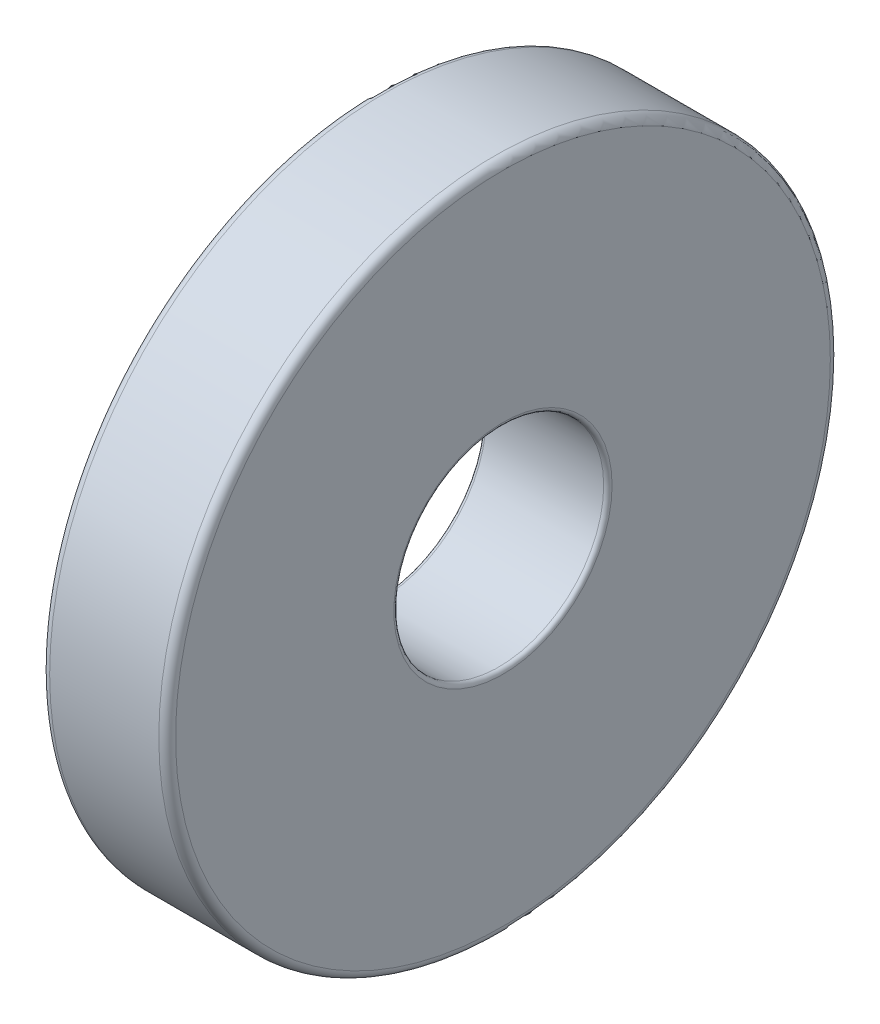
ISO-10303-21;
HEADER;
FILE_DESCRIPTION(('STEP AP214'),'2;1');
FILE_NAME('part.step','',(''),(''),'','','');
FILE_SCHEMA(('AUTOMOTIVE_DESIGN { 1 0 10303 214 1 1 1 1 }'));
ENDSEC;
DATA;
#1=APPLICATION_CONTEXT('core data for automotive mechanical design processes');
#2=APPLICATION_PROTOCOL_DEFINITION('international standard','automotive_design',2000,#1);
#3=PRODUCT_CONTEXT('',#1,'mechanical');
#4=PRODUCT('Part','Part','',(#3));
#5=PRODUCT_RELATED_PRODUCT_CATEGORY('part','',(#4));
#6=PRODUCT_DEFINITION_FORMATION('','',#4);
#7=PRODUCT_DEFINITION_CONTEXT('part definition',#1,'design');
#8=PRODUCT_DEFINITION('design','',#6,#7);
#9=PRODUCT_DEFINITION_SHAPE('','',#8);
#10=(LENGTH_UNIT() NAMED_UNIT(*) SI_UNIT(.MILLI.,.METRE.));
#11=(NAMED_UNIT(*) PLANE_ANGLE_UNIT() SI_UNIT($,.RADIAN.));
#12=(NAMED_UNIT(*) SI_UNIT($,.STERADIAN.) SOLID_ANGLE_UNIT());
#13=UNCERTAINTY_MEASURE_WITH_UNIT(LENGTH_MEASURE(1.E-05),#10,'distance_accuracy_value','');
#14=(GEOMETRIC_REPRESENTATION_CONTEXT(3) GLOBAL_UNCERTAINTY_ASSIGNED_CONTEXT((#13)) GLOBAL_UNIT_ASSIGNED_CONTEXT((#10,
#11,#12)) REPRESENTATION_CONTEXT('',''));
#15=CARTESIAN_POINT('',(0.,0.,0.));
#16=DIRECTION('',(0.,0.,1.));
#17=DIRECTION('',(1.,0.,0.));
#18=AXIS2_PLACEMENT_3D('',#15,#16,#17);
#19=CARTESIAN_POINT('',(30.,0.,0.));
#20=DIRECTION('',(1.,0.,0.));
#21=DIRECTION('',(0.,0.,-1.));
#22=AXIS2_PLACEMENT_3D('',#19,#20,#21);
#23=PLANE('',#22);
#24=CARTESIAN_POINT('',(30.,0.,0.));
#25=DIRECTION('',(1.,0.,0.));
#26=DIRECTION('',(0.,0.,-1.));
#27=AXIS2_PLACEMENT_3D('',#24,#25,#26);
#28=CIRCLE('',#27,26.);
#29=CARTESIAN_POINT('',(30.,0.,-26.));
#30=VERTEX_POINT('',#29);
#31=EDGE_CURVE('E51',#30,#30,#28,.F.);
#32=ORIENTED_EDGE('',*,*,#31,.T.);
#33=EDGE_LOOP('',(#32));
#34=FACE_BOUND('',#33,.T.);
#35=CARTESIAN_POINT('',(30.,0.,0.));
#36=DIRECTION('',(1.,0.,0.));
#37=DIRECTION('',(0.,0.,-1.));
#38=AXIS2_PLACEMENT_3D('',#35,#36,#37);
#39=CIRCLE('',#38,78.);
#40=CARTESIAN_POINT('',(30.,0.,-78.));
#41=VERTEX_POINT('',#40);
#42=EDGE_CURVE('E79',#41,#41,#39,.T.);
#43=ORIENTED_EDGE('',*,*,#42,.T.);
#44=EDGE_LOOP('',(#43));
#45=FACE_BOUND('',#44,.T.);
#46=ADVANCED_FACE('F43',(#34,#45),#23,.T.);
#47=CARTESIAN_POINT('',(0.,0.,0.));
#48=DIRECTION('',(1.,0.,0.));
#49=DIRECTION('',(0.,0.,-1.));
#50=AXIS2_PLACEMENT_3D('',#47,#48,#49);
#51=PLANE('',#50);
#52=CARTESIAN_POINT('',(0.,0.,0.));
#53=DIRECTION('',(1.,0.,0.));
#54=DIRECTION('',(0.,0.,-1.));
#55=AXIS2_PLACEMENT_3D('',#52,#53,#54);
#56=CIRCLE('',#55,26.);
#57=CARTESIAN_POINT('',(0.,0.,-26.));
#58=VERTEX_POINT('',#57);
#59=EDGE_CURVE('E10',#58,#58,#56,.T.);
#60=ORIENTED_EDGE('',*,*,#59,.T.);
#61=EDGE_LOOP('',(#60));
#62=FACE_BOUND('',#61,.T.);
#63=CARTESIAN_POINT('',(0.,0.,0.));
#64=DIRECTION('',(1.,0.,0.));
#65=DIRECTION('',(0.,0.,-1.));
#66=AXIS2_PLACEMENT_3D('',#63,#64,#65);
#67=CIRCLE('',#66,78.);
#68=CARTESIAN_POINT('',(0.,0.,-78.));
#69=VERTEX_POINT('',#68);
#70=EDGE_CURVE('E67',#69,#69,#67,.F.);
#71=ORIENTED_EDGE('',*,*,#70,.T.);
#72=EDGE_LOOP('',(#71));
#73=FACE_BOUND('',#72,.T.);
#74=ADVANCED_FACE('F105',(#62,#73),#51,.F.);
#75=CARTESIAN_POINT('',(30.,0.,0.));
#76=DIRECTION('',(-1.,0.,0.));
#77=DIRECTION('',(0.,0.,1.));
#78=AXIS2_PLACEMENT_3D('',#75,#76,#77);
#79=CYLINDRICAL_SURFACE('',#78,80.);
#80=CARTESIAN_POINT('',(28.,0.,0.));
#81=DIRECTION('',(1.,0.,0.));
#82=DIRECTION('',(0.,0.,-1.));
#83=AXIS2_PLACEMENT_3D('',#80,#81,#82);
#84=CIRCLE('',#83,80.);
#85=CARTESIAN_POINT('',(28.,0.,-80.));
#86=VERTEX_POINT('',#85);
#87=EDGE_CURVE('E71',#86,#86,#84,.F.);
#88=ORIENTED_EDGE('',*,*,#87,.T.);
#89=EDGE_LOOP('',(#88));
#90=FACE_BOUND('',#89,.T.);
#91=CARTESIAN_POINT('',(2.,0.,0.));
#92=DIRECTION('',(1.,0.,0.));
#93=DIRECTION('',(0.,0.,-1.));
#94=AXIS2_PLACEMENT_3D('',#91,#92,#93);
#95=CIRCLE('',#94,80.);
#96=CARTESIAN_POINT('',(2.,0.,-80.));
#97=VERTEX_POINT('',#96);
#98=EDGE_CURVE('E75',#97,#97,#95,.T.);
#99=ORIENTED_EDGE('',*,*,#98,.T.);
#100=EDGE_LOOP('',(#99));
#101=FACE_BOUND('',#100,.T.);
#102=ADVANCED_FACE('F99',(#90,#101),#79,.T.);
#103=CARTESIAN_POINT('',(30.,0.,0.));
#104=DIRECTION('',(-1.,0.,0.));
#105=DIRECTION('',(0.,0.,1.));
#106=AXIS2_PLACEMENT_3D('',#103,#104,#105);
#107=CYLINDRICAL_SURFACE('',#106,25.);
#108=CARTESIAN_POINT('',(29.,0.,0.));
#109=DIRECTION('',(1.,0.,0.));
#110=DIRECTION('',(0.,0.,-1.));
#111=AXIS2_PLACEMENT_3D('',#108,#109,#110);
#112=CIRCLE('',#111,25.);
#113=CARTESIAN_POINT('',(29.,0.,-25.));
#114=VERTEX_POINT('',#113);
#115=EDGE_CURVE('E56',#114,#114,#112,.T.);
#116=ORIENTED_EDGE('',*,*,#115,.T.);
#117=EDGE_LOOP('',(#116));
#118=FACE_BOUND('',#117,.T.);
#119=CARTESIAN_POINT('',(1.,0.,0.));
#120=DIRECTION('',(1.,0.,0.));
#121=DIRECTION('',(0.,0.,-1.));
#122=AXIS2_PLACEMENT_3D('',#119,#120,#121);
#123=CIRCLE('',#122,25.);
#124=CARTESIAN_POINT('',(1.,0.,-25.));
#125=VERTEX_POINT('',#124);
#126=EDGE_CURVE('E61',#125,#125,#123,.F.);
#127=ORIENTED_EDGE('',*,*,#126,.T.);
#128=EDGE_LOOP('',(#127));
#129=FACE_BOUND('',#128,.T.);
#130=ADVANCED_FACE('F88',(#118,#129),#107,.F.);
#131=CARTESIAN_POINT('',(28.,0.,0.));
#132=DIRECTION('',(1.,0.,0.));
#133=DIRECTION('',(0.,0.,-1.));
#134=AXIS2_PLACEMENT_3D('',#131,#132,#133);
#135=TOROIDAL_SURFACE('',#134,78.,2.);
#136=ORIENTED_EDGE('',*,*,#87,.F.);
#137=EDGE_LOOP('',(#136));
#138=FACE_BOUND('',#137,.T.);
#139=ORIENTED_EDGE('',*,*,#42,.F.);
#140=EDGE_LOOP('',(#139));
#141=FACE_BOUND('',#140,.T.);
#142=ADVANCED_FACE('F85',(#138,#141),#135,.T.);
#143=CARTESIAN_POINT('',(2.,0.,0.));
#144=DIRECTION('',(1.,0.,0.));
#145=DIRECTION('',(0.,0.,-1.));
#146=AXIS2_PLACEMENT_3D('',#143,#144,#145);
#147=TOROIDAL_SURFACE('',#146,78.,2.);
#148=ORIENTED_EDGE('',*,*,#70,.F.);
#149=EDGE_LOOP('',(#148));
#150=FACE_BOUND('',#149,.T.);
#151=ORIENTED_EDGE('',*,*,#98,.F.);
#152=EDGE_LOOP('',(#151));
#153=FACE_BOUND('',#152,.T.);
#154=ADVANCED_FACE('F87',(#150,#153),#147,.T.);
#155=CARTESIAN_POINT('',(29.,0.,0.));
#156=DIRECTION('',(1.,0.,0.));
#157=DIRECTION('',(0.,0.,-1.));
#158=AXIS2_PLACEMENT_3D('',#155,#156,#157);
#159=TOROIDAL_SURFACE('',#158,26.,1.);
#160=ORIENTED_EDGE('',*,*,#31,.F.);
#161=EDGE_LOOP('',(#160));
#162=FACE_BOUND('',#161,.T.);
#163=ORIENTED_EDGE('',*,*,#115,.F.);
#164=EDGE_LOOP('',(#163));
#165=FACE_BOUND('',#164,.T.);
#166=ADVANCED_FACE('F95',(#162,#165),#159,.T.);
#167=CARTESIAN_POINT('',(1.,0.,0.));
#168=DIRECTION('',(1.,0.,0.));
#169=DIRECTION('',(0.,0.,-1.));
#170=AXIS2_PLACEMENT_3D('',#167,#168,#169);
#171=TOROIDAL_SURFACE('',#170,26.,1.);
#172=ORIENTED_EDGE('',*,*,#126,.F.);
#173=EDGE_LOOP('',(#172));
#174=FACE_BOUND('',#173,.T.);
#175=ORIENTED_EDGE('',*,*,#59,.F.);
#176=EDGE_LOOP('',(#175));
#177=FACE_BOUND('',#176,.T.);
#178=ADVANCED_FACE('F45',(#174,#177),#171,.T.);
#179=CLOSED_SHELL('',(#46,#74,#102,#130,#142,#154,#166,#178));
#180=MANIFOLD_SOLID_BREP('B2',#179);
#181=ADVANCED_BREP_SHAPE_REPRESENTATION('',(#18,#180),#14);
#182=SHAPE_DEFINITION_REPRESENTATION(#9,#181);
ENDSEC;
END-ISO-10303-21;
